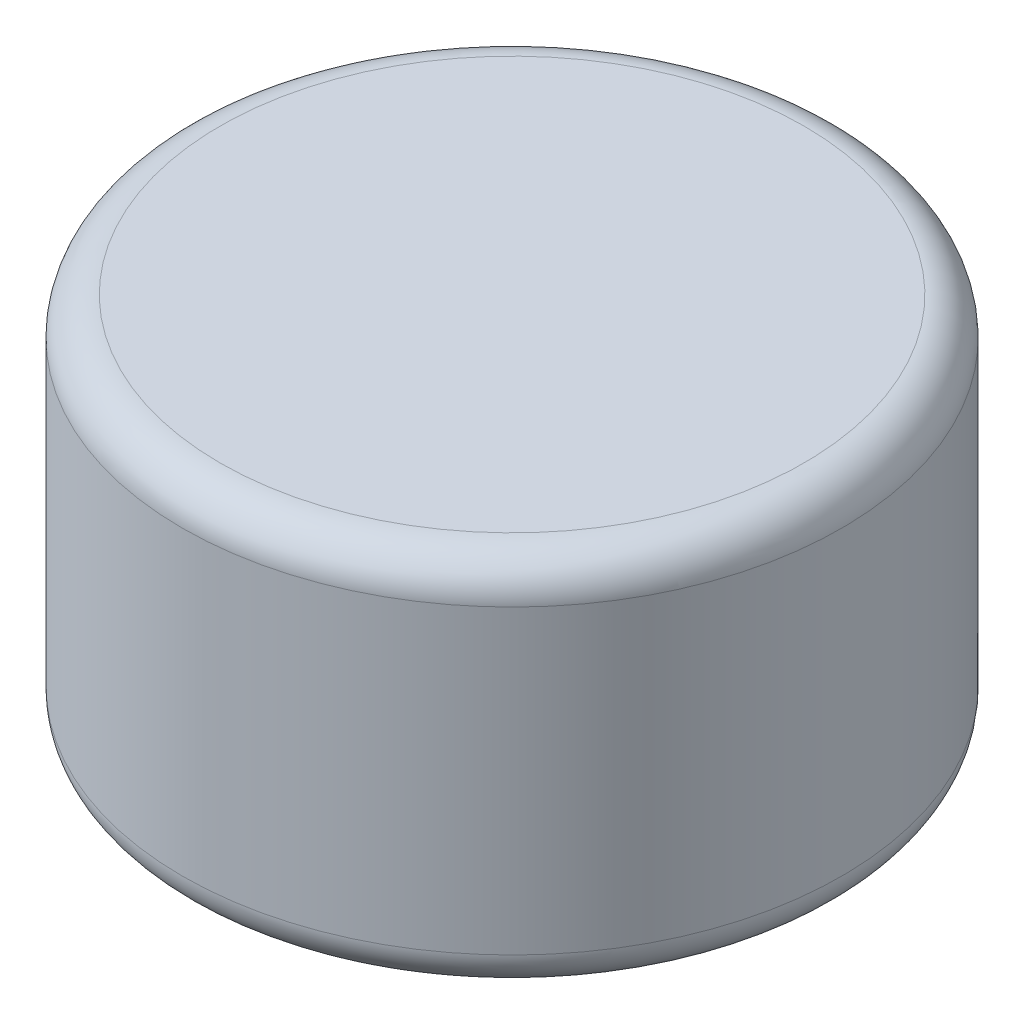
ISO-10303-21;
HEADER;
FILE_DESCRIPTION(('STEP AP214'),'2;1');
FILE_NAME('part.step','',(''),(''),'','','');
FILE_SCHEMA(('AUTOMOTIVE_DESIGN { 1 0 10303 214 1 1 1 1 }'));
ENDSEC;
DATA;
#1=APPLICATION_CONTEXT('core data for automotive mechanical design processes');
#2=APPLICATION_PROTOCOL_DEFINITION('international standard','automotive_design',2000,#1);
#3=PRODUCT_CONTEXT('',#1,'mechanical');
#4=PRODUCT('Part','Part','',(#3));
#5=PRODUCT_RELATED_PRODUCT_CATEGORY('part','',(#4));
#6=PRODUCT_DEFINITION_FORMATION('','',#4);
#7=PRODUCT_DEFINITION_CONTEXT('part definition',#1,'design');
#8=PRODUCT_DEFINITION('design','',#6,#7);
#9=PRODUCT_DEFINITION_SHAPE('','',#8);
#10=(LENGTH_UNIT() NAMED_UNIT(*) SI_UNIT(.MILLI.,.METRE.));
#11=(NAMED_UNIT(*) PLANE_ANGLE_UNIT() SI_UNIT($,.RADIAN.));
#12=(NAMED_UNIT(*) SI_UNIT($,.STERADIAN.) SOLID_ANGLE_UNIT());
#13=UNCERTAINTY_MEASURE_WITH_UNIT(LENGTH_MEASURE(1.E-05),#10,'distance_accuracy_value','');
#14=(GEOMETRIC_REPRESENTATION_CONTEXT(3) GLOBAL_UNCERTAINTY_ASSIGNED_CONTEXT((#13)) GLOBAL_UNIT_ASSIGNED_CONTEXT((#10,
#11,#12)) REPRESENTATION_CONTEXT('',''));
#15=CARTESIAN_POINT('',(0.,0.,0.));
#16=DIRECTION('',(0.,0.,1.));
#17=DIRECTION('',(1.,0.,0.));
#18=AXIS2_PLACEMENT_3D('',#15,#16,#17);
#19=CARTESIAN_POINT('',(0.,3.175,0.));
#20=DIRECTION('',(0.,-1.,0.));
#21=DIRECTION('',(0.,0.,-1.));
#22=AXIS2_PLACEMENT_3D('',#19,#20,#21);
#23=CYLINDRICAL_SURFACE('',#22,5.55625);
#24=CARTESIAN_POINT('',(0.,-2.54,0.));
#25=DIRECTION('',(0.,1.,0.));
#26=DIRECTION('',(0.,0.,1.));
#27=AXIS2_PLACEMENT_3D('',#24,#25,#26);
#28=CIRCLE('',#27,5.55625);
#29=CARTESIAN_POINT('',(0.,-2.54,5.55625));
#30=VERTEX_POINT('',#29);
#31=EDGE_CURVE('E43',#30,#30,#28,.T.);
#32=ORIENTED_EDGE('',*,*,#31,.T.);
#33=EDGE_LOOP('',(#32));
#34=FACE_BOUND('',#33,.T.);
#35=CARTESIAN_POINT('',(0.,2.54,0.));
#36=DIRECTION('',(0.,1.,0.));
#37=DIRECTION('',(0.,0.,1.));
#38=AXIS2_PLACEMENT_3D('',#35,#36,#37);
#39=CIRCLE('',#38,5.55625);
#40=CARTESIAN_POINT('',(0.,2.54,5.55625));
#41=VERTEX_POINT('',#40);
#42=EDGE_CURVE('E47',#41,#41,#39,.F.);
#43=ORIENTED_EDGE('',*,*,#42,.T.);
#44=EDGE_LOOP('',(#43));
#45=FACE_BOUND('',#44,.T.);
#46=ADVANCED_FACE('F32',(#34,#45),#23,.T.);
#47=CARTESIAN_POINT('',(0.,3.175,0.));
#48=DIRECTION('',(0.,1.,0.));
#49=DIRECTION('',(0.,0.,1.));
#50=AXIS2_PLACEMENT_3D('',#47,#48,#49);
#51=PLANE('',#50);
#52=CARTESIAN_POINT('',(0.,3.175,0.));
#53=DIRECTION('',(0.,1.,0.));
#54=DIRECTION('',(0.,0.,1.));
#55=AXIS2_PLACEMENT_3D('',#52,#53,#54);
#56=CIRCLE('',#55,4.92125);
#57=CARTESIAN_POINT('',(0.,3.175,4.92125));
#58=VERTEX_POINT('',#57);
#59=EDGE_CURVE('E10',#58,#58,#56,.T.);
#60=ORIENTED_EDGE('',*,*,#59,.T.);
#61=EDGE_LOOP('',(#60));
#62=FACE_BOUND('',#61,.T.);
#63=ADVANCED_FACE('F63',(#62),#51,.T.);
#64=CARTESIAN_POINT('',(0.,-3.175,0.));
#65=DIRECTION('',(0.,1.,0.));
#66=DIRECTION('',(0.,0.,1.));
#67=AXIS2_PLACEMENT_3D('',#64,#65,#66);
#68=PLANE('',#67);
#69=CARTESIAN_POINT('',(0.,-3.175,0.));
#70=DIRECTION('',(0.,1.,0.));
#71=DIRECTION('',(0.,0.,1.));
#72=AXIS2_PLACEMENT_3D('',#69,#70,#71);
#73=CIRCLE('',#72,4.92125);
#74=CARTESIAN_POINT('',(0.,-3.175,4.92125));
#75=VERTEX_POINT('',#74);
#76=EDGE_CURVE('E39',#75,#75,#73,.F.);
#77=ORIENTED_EDGE('',*,*,#76,.T.);
#78=EDGE_LOOP('',(#77));
#79=FACE_BOUND('',#78,.T.);
#80=ADVANCED_FACE('F60',(#79),#68,.F.);
#81=CARTESIAN_POINT('',(0.,-2.54,0.));
#82=DIRECTION('',(0.,1.,0.));
#83=DIRECTION('',(0.,0.,1.));
#84=AXIS2_PLACEMENT_3D('',#81,#82,#83);
#85=TOROIDAL_SURFACE('',#84,4.92125,0.635);
#86=ORIENTED_EDGE('',*,*,#76,.F.);
#87=EDGE_LOOP('',(#86));
#88=FACE_BOUND('',#87,.T.);
#89=ORIENTED_EDGE('',*,*,#31,.F.);
#90=EDGE_LOOP('',(#89));
#91=FACE_BOUND('',#90,.T.);
#92=ADVANCED_FACE('F56',(#88,#91),#85,.T.);
#93=CARTESIAN_POINT('',(0.,2.54,0.));
#94=DIRECTION('',(0.,1.,0.));
#95=DIRECTION('',(0.,0.,1.));
#96=AXIS2_PLACEMENT_3D('',#93,#94,#95);
#97=TOROIDAL_SURFACE('',#96,4.92125,0.635);
#98=ORIENTED_EDGE('',*,*,#42,.F.);
#99=EDGE_LOOP('',(#98));
#100=FACE_BOUND('',#99,.T.);
#101=ORIENTED_EDGE('',*,*,#59,.F.);
#102=EDGE_LOOP('',(#101));
#103=FACE_BOUND('',#102,.T.);
#104=ADVANCED_FACE('F34',(#100,#103),#97,.T.);
#105=CLOSED_SHELL('',(#46,#63,#80,#92,#104));
#106=MANIFOLD_SOLID_BREP('B2',#105);
#107=ADVANCED_BREP_SHAPE_REPRESENTATION('',(#18,#106),#14);
#108=SHAPE_DEFINITION_REPRESENTATION(#9,#107);
ENDSEC;
END-ISO-10303-21;
